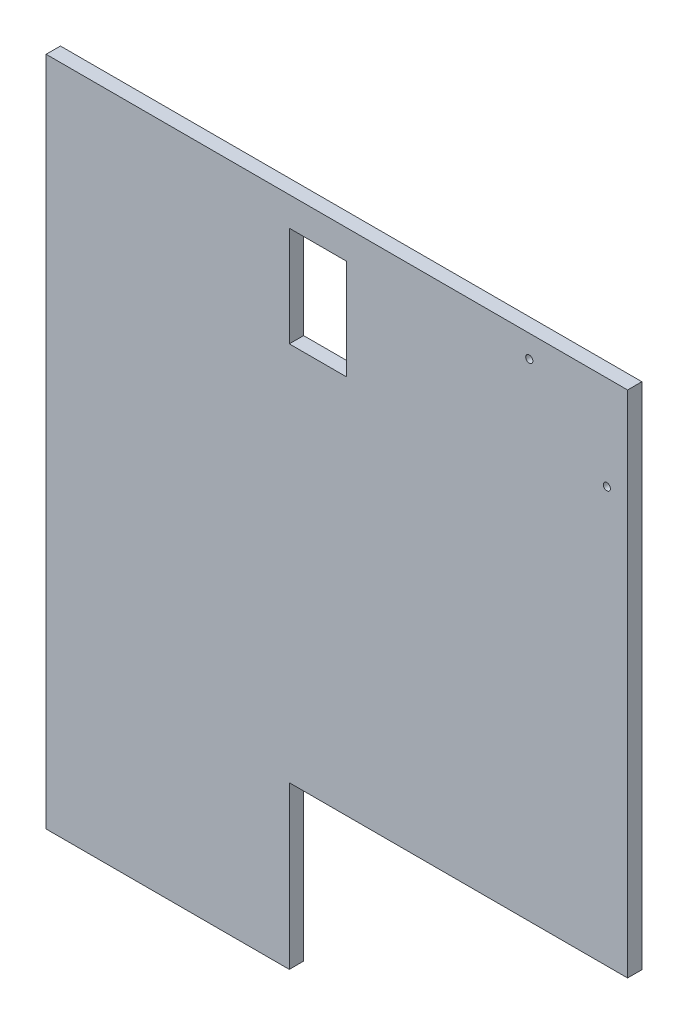
ISO-10303-21;
HEADER;
FILE_DESCRIPTION(('STEP AP214'),'2;1');
FILE_NAME('part.step','',(''),(''),'','','');
FILE_SCHEMA(('AUTOMOTIVE_DESIGN { 1 0 10303 214 1 1 1 1 }'));
ENDSEC;
DATA;
#1=APPLICATION_CONTEXT('core data for automotive mechanical design processes');
#2=APPLICATION_PROTOCOL_DEFINITION('international standard','automotive_design',2000,#1);
#3=PRODUCT_CONTEXT('',#1,'mechanical');
#4=PRODUCT('Part','Part','',(#3));
#5=PRODUCT_RELATED_PRODUCT_CATEGORY('part','',(#4));
#6=PRODUCT_DEFINITION_FORMATION('','',#4);
#7=PRODUCT_DEFINITION_CONTEXT('part definition',#1,'design');
#8=PRODUCT_DEFINITION('design','',#6,#7);
#9=PRODUCT_DEFINITION_SHAPE('','',#8);
#10=(LENGTH_UNIT() NAMED_UNIT(*) SI_UNIT(.MILLI.,.METRE.));
#11=(NAMED_UNIT(*) PLANE_ANGLE_UNIT() SI_UNIT($,.RADIAN.));
#12=(NAMED_UNIT(*) SI_UNIT($,.STERADIAN.) SOLID_ANGLE_UNIT());
#13=UNCERTAINTY_MEASURE_WITH_UNIT(LENGTH_MEASURE(1.E-05),#10,'distance_accuracy_value','');
#14=(GEOMETRIC_REPRESENTATION_CONTEXT(3) GLOBAL_UNCERTAINTY_ASSIGNED_CONTEXT((#13)) GLOBAL_UNIT_ASSIGNED_CONTEXT((#10,
#11,#12)) REPRESENTATION_CONTEXT('',''));
#15=CARTESIAN_POINT('',(0.,0.,0.));
#16=DIRECTION('',(0.,0.,1.));
#17=DIRECTION('',(1.,0.,0.));
#18=AXIS2_PLACEMENT_3D('',#15,#16,#17);
#19=CARTESIAN_POINT('',(0.,-9378.,-200.));
#20=DIRECTION('',(-1.,0.,0.));
#21=DIRECTION('',(0.,0.,1.));
#22=AXIS2_PLACEMENT_3D('',#19,#20,#21);
#23=PLANE('',#22);
#24=DIRECTION('',(0.,-1.,0.));
#25=VECTOR('',#24,1.);
#26=CARTESIAN_POINT('',(0.,-9378.,0.));
#27=LINE('',#26,#25);
#28=CARTESIAN_POINT('',(0.,0.,0.));
#29=VERTEX_POINT('',#28);
#30=CARTESIAN_POINT('',(0.,-9378.,0.));
#31=VERTEX_POINT('',#30);
#32=EDGE_CURVE('E153',#29,#31,#27,.T.);
#33=ORIENTED_EDGE('',*,*,#32,.F.);
#34=DIRECTION('',(0.,0.,1.));
#35=VECTOR('',#34,1.);
#36=CARTESIAN_POINT('',(0.,0.,-200.));
#37=LINE('',#36,#35);
#38=CARTESIAN_POINT('',(0.,0.,-200.));
#39=VERTEX_POINT('',#38);
#40=EDGE_CURVE('E11',#39,#29,#37,.T.);
#41=ORIENTED_EDGE('',*,*,#40,.F.);
#42=DIRECTION('',(0.,-1.,0.));
#43=VECTOR('',#42,1.);
#44=CARTESIAN_POINT('',(0.,-9378.,-200.));
#45=LINE('',#44,#43);
#46=CARTESIAN_POINT('',(0.,-9378.,-200.));
#47=VERTEX_POINT('',#46);
#48=EDGE_CURVE('E157',#39,#47,#45,.T.);
#49=ORIENTED_EDGE('',*,*,#48,.T.);
#50=DIRECTION('',(0.,0.,1.));
#51=VECTOR('',#50,1.);
#52=CARTESIAN_POINT('',(0.,-9378.,-200.));
#53=LINE('',#52,#51);
#54=EDGE_CURVE('E42',#47,#31,#53,.T.);
#55=ORIENTED_EDGE('',*,*,#54,.T.);
#56=EDGE_LOOP('',(#33,#41,#49,#55));
#57=FACE_BOUND('',#56,.T.);
#58=ADVANCED_FACE('F39',(#57),#23,.T.);
#59=CARTESIAN_POINT('',(0.,0.,-200.));
#60=DIRECTION('',(0.,1.,0.));
#61=DIRECTION('',(0.,0.,1.));
#62=AXIS2_PLACEMENT_3D('',#59,#60,#61);
#63=PLANE('',#62);
#64=DIRECTION('',(-1.,0.,0.));
#65=VECTOR('',#64,1.);
#66=CARTESIAN_POINT('',(0.,0.,0.));
#67=LINE('',#66,#65);
#68=CARTESIAN_POINT('',(8127.,0.,0.));
#69=VERTEX_POINT('',#68);
#70=EDGE_CURVE('E161',#69,#29,#67,.T.);
#71=ORIENTED_EDGE('',*,*,#70,.F.);
#72=DIRECTION('',(0.,0.,1.));
#73=VECTOR('',#72,1.);
#74=CARTESIAN_POINT('',(8127.,0.,-200.));
#75=LINE('',#74,#73);
#76=CARTESIAN_POINT('',(8127.,0.,-200.));
#77=VERTEX_POINT('',#76);
#78=EDGE_CURVE('E47',#77,#69,#75,.T.);
#79=ORIENTED_EDGE('',*,*,#78,.F.);
#80=DIRECTION('',(-1.,0.,0.));
#81=VECTOR('',#80,1.);
#82=CARTESIAN_POINT('',(0.,0.,-200.));
#83=LINE('',#82,#81);
#84=EDGE_CURVE('E173',#77,#39,#83,.T.);
#85=ORIENTED_EDGE('',*,*,#84,.T.);
#86=ORIENTED_EDGE('',*,*,#40,.T.);
#87=EDGE_LOOP('',(#71,#79,#85,#86));
#88=FACE_BOUND('',#87,.T.);
#89=ADVANCED_FACE('F210',(#88),#63,.T.);
#90=CARTESIAN_POINT('',(8127.,0.,-200.));
#91=DIRECTION('',(1.,0.,0.));
#92=DIRECTION('',(0.,0.,-1.));
#93=AXIS2_PLACEMENT_3D('',#90,#91,#92);
#94=PLANE('',#93);
#95=DIRECTION('',(0.,1.,0.));
#96=VECTOR('',#95,1.);
#97=CARTESIAN_POINT('',(8127.,0.,0.));
#98=LINE('',#97,#96);
#99=CARTESIAN_POINT('',(8127.,-7117.99999999999,0.));
#100=VERTEX_POINT('',#99);
#101=EDGE_CURVE('E187',#100,#69,#98,.T.);
#102=ORIENTED_EDGE('',*,*,#101,.F.);
#103=DIRECTION('',(0.,0.,1.));
#104=VECTOR('',#103,1.);
#105=CARTESIAN_POINT('',(8127.,-7117.99999999999,-200.));
#106=LINE('',#105,#104);
#107=CARTESIAN_POINT('',(8127.,-7117.99999999999,-200.));
#108=VERTEX_POINT('',#107);
#109=EDGE_CURVE('E193',#108,#100,#106,.T.);
#110=ORIENTED_EDGE('',*,*,#109,.F.);
#111=DIRECTION('',(0.,1.,0.));
#112=VECTOR('',#111,1.);
#113=CARTESIAN_POINT('',(8127.,0.,-200.));
#114=LINE('',#113,#112);
#115=EDGE_CURVE('E170',#108,#77,#114,.T.);
#116=ORIENTED_EDGE('',*,*,#115,.T.);
#117=ORIENTED_EDGE('',*,*,#78,.T.);
#118=EDGE_LOOP('',(#102,#110,#116,#117));
#119=FACE_BOUND('',#118,.T.);
#120=ADVANCED_FACE('F221',(#119),#94,.T.);
#121=CARTESIAN_POINT('',(8127.,-7117.99999999999,-200.));
#122=DIRECTION('',(0.,-1.,0.));
#123=DIRECTION('',(0.,0.,-1.));
#124=AXIS2_PLACEMENT_3D('',#121,#122,#123);
#125=PLANE('',#124);
#126=DIRECTION('',(1.,0.,0.));
#127=VECTOR('',#126,1.);
#128=CARTESIAN_POINT('',(8127.,-7117.99999999999,0.));
#129=LINE('',#128,#127);
#130=CARTESIAN_POINT('',(3399.,-7117.99999999999,0.));
#131=VERTEX_POINT('',#130);
#132=EDGE_CURVE('E184',#131,#100,#129,.T.);
#133=ORIENTED_EDGE('',*,*,#132,.F.);
#134=DIRECTION('',(0.,0.,1.));
#135=VECTOR('',#134,1.);
#136=CARTESIAN_POINT('',(3399.,-7117.99999999999,-200.));
#137=LINE('',#136,#135);
#138=CARTESIAN_POINT('',(3399.,-7117.99999999999,-200.));
#139=VERTEX_POINT('',#138);
#140=EDGE_CURVE('E195',#139,#131,#137,.T.);
#141=ORIENTED_EDGE('',*,*,#140,.F.);
#142=DIRECTION('',(1.,0.,0.));
#143=VECTOR('',#142,1.);
#144=CARTESIAN_POINT('',(8127.,-7117.99999999999,-200.));
#145=LINE('',#144,#143);
#146=EDGE_CURVE('E167',#139,#108,#145,.T.);
#147=ORIENTED_EDGE('',*,*,#146,.T.);
#148=ORIENTED_EDGE('',*,*,#109,.T.);
#149=EDGE_LOOP('',(#133,#141,#147,#148));
#150=FACE_BOUND('',#149,.T.);
#151=ADVANCED_FACE('F219',(#150),#125,.T.);
#152=CARTESIAN_POINT('',(3399.,-7117.99999999999,-200.));
#153=DIRECTION('',(1.,0.,0.));
#154=DIRECTION('',(0.,1.,0.));
#155=AXIS2_PLACEMENT_3D('',#152,#153,#154);
#156=PLANE('',#155);
#157=DIRECTION('',(0.,1.,0.));
#158=VECTOR('',#157,1.);
#159=CARTESIAN_POINT('',(3399.,-7117.99999999999,0.));
#160=LINE('',#159,#158);
#161=CARTESIAN_POINT('',(3399.,-9378.,0.));
#162=VERTEX_POINT('',#161);
#163=EDGE_CURVE('E181',#162,#131,#160,.T.);
#164=ORIENTED_EDGE('',*,*,#163,.F.);
#165=DIRECTION('',(0.,0.,1.));
#166=VECTOR('',#165,1.);
#167=CARTESIAN_POINT('',(3399.,-9378.,-200.));
#168=LINE('',#167,#166);
#169=CARTESIAN_POINT('',(3399.,-9378.,-200.));
#170=VERTEX_POINT('',#169);
#171=EDGE_CURVE('E196',#170,#162,#168,.T.);
#172=ORIENTED_EDGE('',*,*,#171,.F.);
#173=DIRECTION('',(0.,1.,0.));
#174=VECTOR('',#173,1.);
#175=CARTESIAN_POINT('',(3399.,-7117.99999999999,-200.));
#176=LINE('',#175,#174);
#177=EDGE_CURVE('E164',#170,#139,#176,.T.);
#178=ORIENTED_EDGE('',*,*,#177,.T.);
#179=ORIENTED_EDGE('',*,*,#140,.T.);
#180=EDGE_LOOP('',(#164,#172,#178,#179));
#181=FACE_BOUND('',#180,.T.);
#182=ADVANCED_FACE('F216',(#181),#156,.T.);
#183=CARTESIAN_POINT('',(3399.,-9378.,-200.));
#184=DIRECTION('',(0.,-1.,0.));
#185=DIRECTION('',(0.,0.,-1.));
#186=AXIS2_PLACEMENT_3D('',#183,#184,#185);
#187=PLANE('',#186);
#188=DIRECTION('',(1.,0.,0.));
#189=VECTOR('',#188,1.);
#190=CARTESIAN_POINT('',(3399.,-9378.,0.));
#191=LINE('',#190,#189);
#192=EDGE_CURVE('E178',#31,#162,#191,.T.);
#193=ORIENTED_EDGE('',*,*,#192,.F.);
#194=ORIENTED_EDGE('',*,*,#54,.F.);
#195=DIRECTION('',(1.,0.,0.));
#196=VECTOR('',#195,1.);
#197=CARTESIAN_POINT('',(3399.,-9378.,-200.));
#198=LINE('',#197,#196);
#199=EDGE_CURVE('E160',#47,#170,#198,.T.);
#200=ORIENTED_EDGE('',*,*,#199,.T.);
#201=ORIENTED_EDGE('',*,*,#171,.T.);
#202=EDGE_LOOP('',(#193,#194,#200,#201));
#203=FACE_BOUND('',#202,.T.);
#204=ADVANCED_FACE('F204',(#203),#187,.T.);
#205=CARTESIAN_POINT('',(0.,0.,-200.));
#206=DIRECTION('',(0.,0.,-1.));
#207=DIRECTION('',(-1.,0.,0.));
#208=AXIS2_PLACEMENT_3D('',#205,#206,#207);
#209=PLANE('',#208);
#210=CARTESIAN_POINT('',(7837.41073710319,-1315.32035333426,-200.));
#211=DIRECTION('',(0.,0.,1.));
#212=DIRECTION('',(1.,0.,0.));
#213=AXIS2_PLACEMENT_3D('',#210,#211,#212);
#214=CIRCLE('',#213,50.);
#215=CARTESIAN_POINT('',(7887.41073710319,-1315.32035333426,-200.));
#216=VERTEX_POINT('',#215);
#217=EDGE_CURVE('E343',#216,#216,#214,.T.);
#218=ORIENTED_EDGE('',*,*,#217,.T.);
#219=EDGE_LOOP('',(#218));
#220=FACE_BOUND('',#219,.T.);
#221=CARTESIAN_POINT('',(6753.16953636864,-313.5068462228,-200.));
#222=DIRECTION('',(0.,0.,1.));
#223=DIRECTION('',(1.,0.,0.));
#224=AXIS2_PLACEMENT_3D('',#221,#222,#223);
#225=CIRCLE('',#224,50.);
#226=CARTESIAN_POINT('',(6803.16953636864,-313.5068462228,-200.));
#227=VERTEX_POINT('',#226);
#228=EDGE_CURVE('E147',#227,#227,#225,.T.);
#229=ORIENTED_EDGE('',*,*,#228,.T.);
#230=EDGE_LOOP('',(#229));
#231=FACE_BOUND('',#230,.T.);
#232=DIRECTION('',(0.,-1.,0.));
#233=VECTOR('',#232,1.);
#234=CARTESIAN_POINT('',(3399.,-406.,-200.));
#235=LINE('',#234,#233);
#236=CARTESIAN_POINT('',(3399.,-406.,-200.));
#237=VERTEX_POINT('',#236);
#238=CARTESIAN_POINT('',(3399.,-1806.,-200.));
#239=VERTEX_POINT('',#238);
#240=EDGE_CURVE('E118',#237,#239,#235,.T.);
#241=ORIENTED_EDGE('',*,*,#240,.T.);
#242=DIRECTION('',(1.,0.,0.));
#243=VECTOR('',#242,1.);
#244=CARTESIAN_POINT('',(3399.,-1806.,-200.));
#245=LINE('',#244,#243);
#246=CARTESIAN_POINT('',(4199.,-1806.,-200.));
#247=VERTEX_POINT('',#246);
#248=EDGE_CURVE('E127',#239,#247,#245,.T.);
#249=ORIENTED_EDGE('',*,*,#248,.T.);
#250=DIRECTION('',(0.,1.,0.));
#251=VECTOR('',#250,1.);
#252=CARTESIAN_POINT('',(4199.,-406.,-200.));
#253=LINE('',#252,#251);
#254=CARTESIAN_POINT('',(4199.,-406.,-200.));
#255=VERTEX_POINT('',#254);
#256=EDGE_CURVE('E55',#247,#255,#253,.T.);
#257=ORIENTED_EDGE('',*,*,#256,.T.);
#258=DIRECTION('',(-1.,0.,0.));
#259=VECTOR('',#258,1.);
#260=CARTESIAN_POINT('',(3399.,-406.,-200.));
#261=LINE('',#260,#259);
#262=EDGE_CURVE('E124',#255,#237,#261,.T.);
#263=ORIENTED_EDGE('',*,*,#262,.T.);
#264=EDGE_LOOP('',(#241,#249,#257,#263));
#265=FACE_BOUND('',#264,.T.);
#266=ORIENTED_EDGE('',*,*,#48,.F.);
#267=ORIENTED_EDGE('',*,*,#84,.F.);
#268=ORIENTED_EDGE('',*,*,#115,.F.);
#269=ORIENTED_EDGE('',*,*,#146,.F.);
#270=ORIENTED_EDGE('',*,*,#177,.F.);
#271=ORIENTED_EDGE('',*,*,#199,.F.);
#272=EDGE_LOOP('',(#266,#267,#268,#269,#270,#271));
#273=FACE_BOUND('',#272,.T.);
#274=ADVANCED_FACE('F131',(#220,#231,#265,#273),#209,.T.);
#275=CARTESIAN_POINT('',(0.,0.,0.));
#276=DIRECTION('',(0.,0.,-1.));
#277=DIRECTION('',(-1.,0.,0.));
#278=AXIS2_PLACEMENT_3D('',#275,#276,#277);
#279=PLANE('',#278);
#280=CARTESIAN_POINT('',(7837.41073710319,-1315.32035333426,0.));
#281=DIRECTION('',(0.,0.,1.));
#282=DIRECTION('',(1.,0.,0.));
#283=AXIS2_PLACEMENT_3D('',#280,#281,#282);
#284=CIRCLE('',#283,50.);
#285=CARTESIAN_POINT('',(7887.41073710319,-1315.32035333426,0.));
#286=VERTEX_POINT('',#285);
#287=EDGE_CURVE('E346',#286,#286,#284,.T.);
#288=ORIENTED_EDGE('',*,*,#287,.F.);
#289=EDGE_LOOP('',(#288));
#290=FACE_BOUND('',#289,.T.);
#291=CARTESIAN_POINT('',(6753.16953636864,-313.5068462228,0.));
#292=DIRECTION('',(0.,0.,1.));
#293=DIRECTION('',(1.,0.,0.));
#294=AXIS2_PLACEMENT_3D('',#291,#292,#293);
#295=CIRCLE('',#294,50.);
#296=CARTESIAN_POINT('',(6803.16953636864,-313.5068462228,0.));
#297=VERTEX_POINT('',#296);
#298=EDGE_CURVE('E140',#297,#297,#295,.T.);
#299=ORIENTED_EDGE('',*,*,#298,.F.);
#300=EDGE_LOOP('',(#299));
#301=FACE_BOUND('',#300,.T.);
#302=DIRECTION('',(1.,0.,0.));
#303=VECTOR('',#302,1.);
#304=CARTESIAN_POINT('',(3399.,-1806.,0.));
#305=LINE('',#304,#303);
#306=CARTESIAN_POINT('',(3399.,-1806.,0.));
#307=VERTEX_POINT('',#306);
#308=CARTESIAN_POINT('',(4199.,-1806.,0.));
#309=VERTEX_POINT('',#308);
#310=EDGE_CURVE('E146',#307,#309,#305,.T.);
#311=ORIENTED_EDGE('',*,*,#310,.F.);
#312=DIRECTION('',(0.,-1.,0.));
#313=VECTOR('',#312,1.);
#314=CARTESIAN_POINT('',(3399.,-406.,0.));
#315=LINE('',#314,#313);
#316=CARTESIAN_POINT('',(3399.,-406.,0.));
#317=VERTEX_POINT('',#316);
#318=EDGE_CURVE('E63',#317,#307,#315,.T.);
#319=ORIENTED_EDGE('',*,*,#318,.F.);
#320=DIRECTION('',(-1.,0.,0.));
#321=VECTOR('',#320,1.);
#322=CARTESIAN_POINT('',(3399.,-406.,0.));
#323=LINE('',#322,#321);
#324=CARTESIAN_POINT('',(4199.,-406.,0.));
#325=VERTEX_POINT('',#324);
#326=EDGE_CURVE('E134',#325,#317,#323,.T.);
#327=ORIENTED_EDGE('',*,*,#326,.F.);
#328=DIRECTION('',(0.,1.,0.));
#329=VECTOR('',#328,1.);
#330=CARTESIAN_POINT('',(4199.,-406.,0.));
#331=LINE('',#330,#329);
#332=EDGE_CURVE('E137',#309,#325,#331,.T.);
#333=ORIENTED_EDGE('',*,*,#332,.F.);
#334=EDGE_LOOP('',(#311,#319,#327,#333));
#335=FACE_BOUND('',#334,.T.);
#336=ORIENTED_EDGE('',*,*,#32,.T.);
#337=ORIENTED_EDGE('',*,*,#192,.T.);
#338=ORIENTED_EDGE('',*,*,#163,.T.);
#339=ORIENTED_EDGE('',*,*,#132,.T.);
#340=ORIENTED_EDGE('',*,*,#101,.T.);
#341=ORIENTED_EDGE('',*,*,#70,.T.);
#342=EDGE_LOOP('',(#336,#337,#338,#339,#340,#341));
#343=FACE_BOUND('',#342,.T.);
#344=ADVANCED_FACE('F206',(#290,#301,#335,#343),#279,.F.);
#345=CARTESIAN_POINT('',(3399.,-406.,-200.));
#346=DIRECTION('',(-1.,0.,0.));
#347=DIRECTION('',(0.,0.,1.));
#348=AXIS2_PLACEMENT_3D('',#345,#346,#347);
#349=PLANE('',#348);
#350=ORIENTED_EDGE('',*,*,#318,.T.);
#351=DIRECTION('',(0.,0.,1.));
#352=VECTOR('',#351,1.);
#353=CARTESIAN_POINT('',(3399.,-1806.,-200.));
#354=LINE('',#353,#352);
#355=EDGE_CURVE('E114',#239,#307,#354,.T.);
#356=ORIENTED_EDGE('',*,*,#355,.F.);
#357=ORIENTED_EDGE('',*,*,#240,.F.);
#358=DIRECTION('',(0.,0.,1.));
#359=VECTOR('',#358,1.);
#360=CARTESIAN_POINT('',(3399.,-406.,-200.));
#361=LINE('',#360,#359);
#362=EDGE_CURVE('E151',#237,#317,#361,.T.);
#363=ORIENTED_EDGE('',*,*,#362,.T.);
#364=EDGE_LOOP('',(#350,#356,#357,#363));
#365=FACE_BOUND('',#364,.T.);
#366=ADVANCED_FACE('F116',(#365),#349,.F.);
#367=CARTESIAN_POINT('',(3399.,-406.,-200.));
#368=DIRECTION('',(0.,1.,0.));
#369=DIRECTION('',(0.,0.,1.));
#370=AXIS2_PLACEMENT_3D('',#367,#368,#369);
#371=PLANE('',#370);
#372=ORIENTED_EDGE('',*,*,#326,.T.);
#373=ORIENTED_EDGE('',*,*,#362,.F.);
#374=ORIENTED_EDGE('',*,*,#262,.F.);
#375=DIRECTION('',(0.,0.,1.));
#376=VECTOR('',#375,1.);
#377=CARTESIAN_POINT('',(4199.,-406.,-200.));
#378=LINE('',#377,#376);
#379=EDGE_CURVE('E154',#255,#325,#378,.T.);
#380=ORIENTED_EDGE('',*,*,#379,.T.);
#381=EDGE_LOOP('',(#372,#373,#374,#380));
#382=FACE_BOUND('',#381,.T.);
#383=ADVANCED_FACE('F291',(#382),#371,.F.);
#384=CARTESIAN_POINT('',(4199.,-406.,-200.));
#385=DIRECTION('',(1.,0.,0.));
#386=DIRECTION('',(0.,0.,-1.));
#387=AXIS2_PLACEMENT_3D('',#384,#385,#386);
#388=PLANE('',#387);
#389=ORIENTED_EDGE('',*,*,#332,.T.);
#390=ORIENTED_EDGE('',*,*,#379,.F.);
#391=ORIENTED_EDGE('',*,*,#256,.F.);
#392=DIRECTION('',(0.,0.,1.));
#393=VECTOR('',#392,1.);
#394=CARTESIAN_POINT('',(4199.,-1806.,-200.));
#395=LINE('',#394,#393);
#396=EDGE_CURVE('E123',#247,#309,#395,.T.);
#397=ORIENTED_EDGE('',*,*,#396,.T.);
#398=EDGE_LOOP('',(#389,#390,#391,#397));
#399=FACE_BOUND('',#398,.T.);
#400=ADVANCED_FACE('F300',(#399),#388,.F.);
#401=CARTESIAN_POINT('',(3399.,-1806.,-200.));
#402=DIRECTION('',(0.,-1.,0.));
#403=DIRECTION('',(0.,0.,-1.));
#404=AXIS2_PLACEMENT_3D('',#401,#402,#403);
#405=PLANE('',#404);
#406=ORIENTED_EDGE('',*,*,#310,.T.);
#407=ORIENTED_EDGE('',*,*,#396,.F.);
#408=ORIENTED_EDGE('',*,*,#248,.F.);
#409=ORIENTED_EDGE('',*,*,#355,.T.);
#410=EDGE_LOOP('',(#406,#407,#408,#409));
#411=FACE_BOUND('',#410,.T.);
#412=ADVANCED_FACE('F128',(#411),#405,.F.);
#413=CARTESIAN_POINT('',(6753.16953636864,-313.5068462228,-200.));
#414=DIRECTION('',(0.,0.,1.));
#415=DIRECTION('',(1.,0.,0.));
#416=AXIS2_PLACEMENT_3D('',#413,#414,#415);
#417=CYLINDRICAL_SURFACE('',#416,50.);
#418=ORIENTED_EDGE('',*,*,#228,.F.);
#419=EDGE_LOOP('',(#418));
#420=FACE_BOUND('',#419,.T.);
#421=ORIENTED_EDGE('',*,*,#298,.T.);
#422=EDGE_LOOP('',(#421));
#423=FACE_BOUND('',#422,.T.);
#424=ADVANCED_FACE('F318',(#420,#423),#417,.F.);
#425=CARTESIAN_POINT('',(7837.41073710319,-1315.32035333426,-200.));
#426=DIRECTION('',(0.,0.,1.));
#427=DIRECTION('',(1.,0.,0.));
#428=AXIS2_PLACEMENT_3D('',#425,#426,#427);
#429=CYLINDRICAL_SURFACE('',#428,50.);
#430=ORIENTED_EDGE('',*,*,#217,.F.);
#431=EDGE_LOOP('',(#430));
#432=FACE_BOUND('',#431,.T.);
#433=ORIENTED_EDGE('',*,*,#287,.T.);
#434=EDGE_LOOP('',(#433));
#435=FACE_BOUND('',#434,.T.);
#436=ADVANCED_FACE('F327',(#432,#435),#429,.F.);
#437=CLOSED_SHELL('',(#58,#89,#120,#151,#182,#204,#274,#344,#366,#383,#400,#412,#424,#436));
#438=MANIFOLD_SOLID_BREP('B2',#437);
#439=ADVANCED_BREP_SHAPE_REPRESENTATION('',(#18,#438),#14);
#440=SHAPE_DEFINITION_REPRESENTATION(#9,#439);
ENDSEC;
END-ISO-10303-21;
